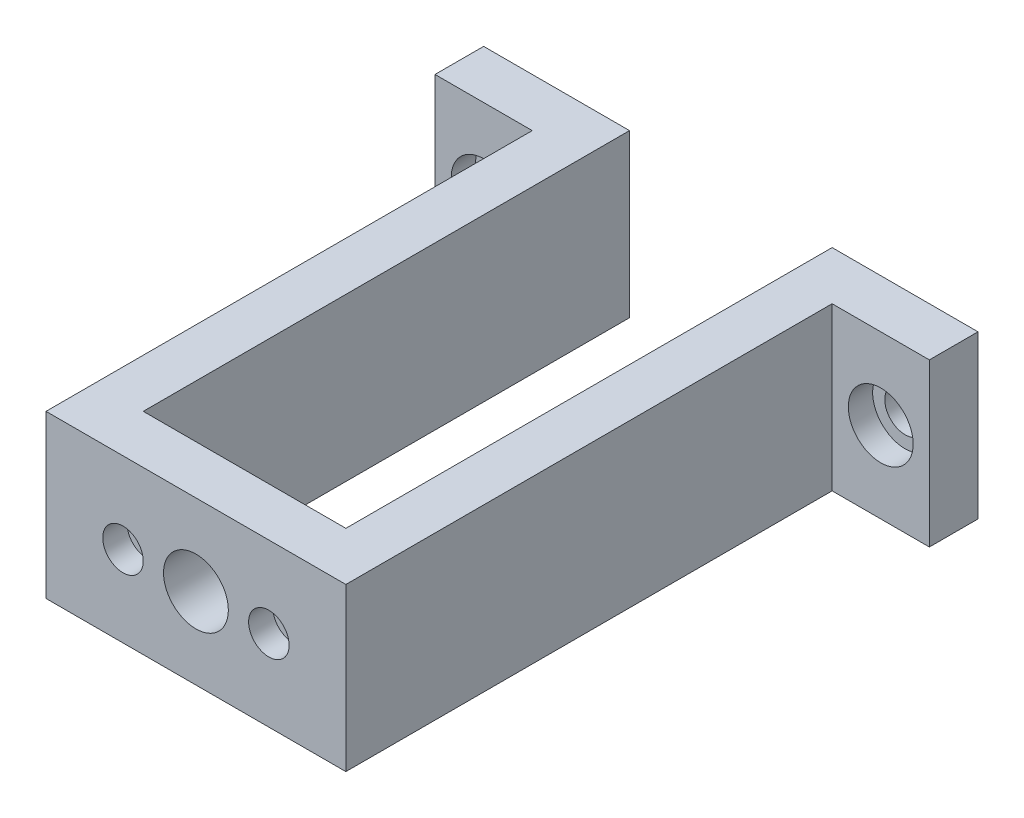
ISO-10303-21;
HEADER;
FILE_DESCRIPTION(('STEP AP214'),'2;1');
FILE_NAME('part.step','',(''),(''),'','','');
FILE_SCHEMA(('AUTOMOTIVE_DESIGN { 1 0 10303 214 1 1 1 1 }'));
ENDSEC;
DATA;
#1=APPLICATION_CONTEXT('core data for automotive mechanical design processes');
#2=APPLICATION_PROTOCOL_DEFINITION('international standard','automotive_design',2000,#1);
#3=PRODUCT_CONTEXT('',#1,'mechanical');
#4=PRODUCT('Part','Part','',(#3));
#5=PRODUCT_RELATED_PRODUCT_CATEGORY('part','',(#4));
#6=PRODUCT_DEFINITION_FORMATION('','',#4);
#7=PRODUCT_DEFINITION_CONTEXT('part definition',#1,'design');
#8=PRODUCT_DEFINITION('design','',#6,#7);
#9=PRODUCT_DEFINITION_SHAPE('','',#8);
#10=(LENGTH_UNIT() NAMED_UNIT(*) SI_UNIT(.MILLI.,.METRE.));
#11=(NAMED_UNIT(*) PLANE_ANGLE_UNIT() SI_UNIT($,.RADIAN.));
#12=(NAMED_UNIT(*) SI_UNIT($,.STERADIAN.) SOLID_ANGLE_UNIT());
#13=UNCERTAINTY_MEASURE_WITH_UNIT(LENGTH_MEASURE(1.E-05),#10,'distance_accuracy_value','');
#14=(GEOMETRIC_REPRESENTATION_CONTEXT(3) GLOBAL_UNCERTAINTY_ASSIGNED_CONTEXT((#13)) GLOBAL_UNIT_ASSIGNED_CONTEXT((#10,
#11,#12)) REPRESENTATION_CONTEXT('',''));
#15=CARTESIAN_POINT('',(0.,0.,0.));
#16=DIRECTION('',(0.,0.,1.));
#17=DIRECTION('',(1.,0.,0.));
#18=AXIS2_PLACEMENT_3D('',#15,#16,#17);
#19=CARTESIAN_POINT('',(-18.5,0.,-30.));
#20=DIRECTION('',(0.,0.,1.));
#21=DIRECTION('',(1.,0.,0.));
#22=AXIS2_PLACEMENT_3D('',#19,#20,#21);
#23=CYLINDRICAL_SURFACE('',#22,1.25);
#24=CARTESIAN_POINT('',(-18.5,0.,-30.));
#25=DIRECTION('',(0.,0.,-1.));
#26=DIRECTION('',(-1.,0.,0.));
#27=AXIS2_PLACEMENT_3D('',#24,#25,#26);
#28=CIRCLE('',#27,1.25);
#29=CARTESIAN_POINT('',(-19.75,0.,-30.));
#30=VERTEX_POINT('',#29);
#31=EDGE_CURVE('E382',#30,#30,#28,.T.);
#32=ORIENTED_EDGE('',*,*,#31,.T.);
#33=EDGE_LOOP('',(#32));
#34=FACE_BOUND('',#33,.T.);
#35=CARTESIAN_POINT('',(-18.5,0.,-28.5));
#36=DIRECTION('',(0.,0.,1.));
#37=DIRECTION('',(1.,0.,0.));
#38=AXIS2_PLACEMENT_3D('',#35,#36,#37);
#39=CIRCLE('',#38,1.25);
#40=CARTESIAN_POINT('',(-17.25,0.,-28.5));
#41=VERTEX_POINT('',#40);
#42=EDGE_CURVE('E406',#41,#41,#39,.T.);
#43=ORIENTED_EDGE('',*,*,#42,.T.);
#44=EDGE_LOOP('',(#43));
#45=FACE_BOUND('',#44,.T.);
#46=ADVANCED_FACE('F55',(#34,#45),#23,.F.);
#47=CARTESIAN_POINT('',(6.,0.,-30.));
#48=DIRECTION('',(0.,0.,1.));
#49=DIRECTION('',(1.,0.,0.));
#50=AXIS2_PLACEMENT_3D('',#47,#48,#49);
#51=CYLINDRICAL_SURFACE('',#50,1.25);
#52=CARTESIAN_POINT('',(6.,0.,-30.));
#53=DIRECTION('',(0.,0.,-1.));
#54=DIRECTION('',(-1.,0.,0.));
#55=AXIS2_PLACEMENT_3D('',#52,#53,#54);
#56=CIRCLE('',#55,1.25);
#57=CARTESIAN_POINT('',(4.75,0.,-30.));
#58=VERTEX_POINT('',#57);
#59=EDGE_CURVE('E393',#58,#58,#56,.T.);
#60=ORIENTED_EDGE('',*,*,#59,.T.);
#61=EDGE_LOOP('',(#60));
#62=FACE_BOUND('',#61,.T.);
#63=CARTESIAN_POINT('',(6.,0.,-28.5));
#64=DIRECTION('',(0.,0.,1.));
#65=DIRECTION('',(1.,0.,0.));
#66=AXIS2_PLACEMENT_3D('',#63,#64,#65);
#67=CIRCLE('',#66,1.25);
#68=CARTESIAN_POINT('',(7.25,0.,-28.5));
#69=VERTEX_POINT('',#68);
#70=EDGE_CURVE('E403',#69,#69,#67,.T.);
#71=ORIENTED_EDGE('',*,*,#70,.T.);
#72=EDGE_LOOP('',(#71));
#73=FACE_BOUND('',#72,.T.);
#74=ADVANCED_FACE('F282',(#62,#73),#51,.F.);
#75=CARTESIAN_POINT('',(-12.5,-5.,3.));
#76=DIRECTION('',(0.,1.,0.));
#77=DIRECTION('',(0.,0.,1.));
#78=AXIS2_PLACEMENT_3D('',#75,#76,#77);
#79=PLANE('',#78);
#80=DIRECTION('',(-1.,0.,0.));
#81=VECTOR('',#80,1.);
#82=CARTESIAN_POINT('',(0.,-5.,-27.));
#83=LINE('',#82,#81);
#84=CARTESIAN_POINT('',(9.,-5.,-27.));
#85=VERTEX_POINT('',#84);
#86=CARTESIAN_POINT('',(3.,-5.,-27.));
#87=VERTEX_POINT('',#86);
#88=EDGE_CURVE('E144',#85,#87,#83,.T.);
#89=ORIENTED_EDGE('',*,*,#88,.T.);
#90=DIRECTION('',(0.,0.,-1.));
#91=VECTOR('',#90,1.);
#92=CARTESIAN_POINT('',(3.,-5.,13.4403065089106));
#93=LINE('',#92,#91);
#94=CARTESIAN_POINT('',(3.,-5.,3.));
#95=VERTEX_POINT('',#94);
#96=EDGE_CURVE('E191',#95,#87,#93,.T.);
#97=ORIENTED_EDGE('',*,*,#96,.F.);
#98=DIRECTION('',(1.,0.,0.));
#99=VECTOR('',#98,1.);
#100=CARTESIAN_POINT('',(-12.5,-5.,3.));
#101=LINE('',#100,#99);
#102=CARTESIAN_POINT('',(-15.5,-5.,3.));
#103=VERTEX_POINT('',#102);
#104=EDGE_CURVE('E64',#103,#95,#101,.T.);
#105=ORIENTED_EDGE('',*,*,#104,.F.);
#106=DIRECTION('',(0.,0.,-1.));
#107=VECTOR('',#106,1.);
#108=CARTESIAN_POINT('',(-15.5,-5.,13.4403065089106));
#109=LINE('',#108,#107);
#110=CARTESIAN_POINT('',(-15.5,-5.,-27.));
#111=VERTEX_POINT('',#110);
#112=EDGE_CURVE('E226',#103,#111,#109,.T.);
#113=ORIENTED_EDGE('',*,*,#112,.T.);
#114=DIRECTION('',(1.,0.,0.));
#115=VECTOR('',#114,1.);
#116=CARTESIAN_POINT('',(0.,-5.,-27.));
#117=LINE('',#116,#115);
#118=CARTESIAN_POINT('',(-21.5,-5.,-27.));
#119=VERTEX_POINT('',#118);
#120=EDGE_CURVE('E375',#119,#111,#117,.T.);
#121=ORIENTED_EDGE('',*,*,#120,.F.);
#122=DIRECTION('',(0.,0.,1.));
#123=VECTOR('',#122,1.);
#124=CARTESIAN_POINT('',(-21.5,-5.,-30.));
#125=LINE('',#124,#123);
#126=CARTESIAN_POINT('',(-21.5,-5.,-30.));
#127=VERTEX_POINT('',#126);
#128=EDGE_CURVE('E215',#127,#119,#125,.T.);
#129=ORIENTED_EDGE('',*,*,#128,.F.);
#130=DIRECTION('',(-1.,0.,0.));
#131=VECTOR('',#130,1.);
#132=CARTESIAN_POINT('',(-12.5,-5.,-30.));
#133=LINE('',#132,#131);
#134=CARTESIAN_POINT('',(-12.5,-5.,-30.));
#135=VERTEX_POINT('',#134);
#136=EDGE_CURVE('E199',#135,#127,#133,.T.);
#137=ORIENTED_EDGE('',*,*,#136,.F.);
#138=DIRECTION('',(0.,0.,1.));
#139=VECTOR('',#138,1.);
#140=CARTESIAN_POINT('',(-12.5,-5.,-30.));
#141=LINE('',#140,#139);
#142=CARTESIAN_POINT('',(-12.5,-5.,0.));
#143=VERTEX_POINT('',#142);
#144=EDGE_CURVE('E218',#135,#143,#141,.T.);
#145=ORIENTED_EDGE('',*,*,#144,.T.);
#146=DIRECTION('',(1.,0.,0.));
#147=VECTOR('',#146,1.);
#148=CARTESIAN_POINT('',(-12.5,-5.,0.));
#149=LINE('',#148,#147);
#150=CARTESIAN_POINT('',(0.,-5.,0.));
#151=VERTEX_POINT('',#150);
#152=EDGE_CURVE('E244',#143,#151,#149,.T.);
#153=ORIENTED_EDGE('',*,*,#152,.T.);
#154=DIRECTION('',(0.,0.,1.));
#155=VECTOR('',#154,1.);
#156=CARTESIAN_POINT('',(0.,-5.,-30.));
#157=LINE('',#156,#155);
#158=CARTESIAN_POINT('',(0.,-5.,-30.));
#159=VERTEX_POINT('',#158);
#160=EDGE_CURVE('E171',#159,#151,#157,.T.);
#161=ORIENTED_EDGE('',*,*,#160,.F.);
#162=DIRECTION('',(1.,0.,0.));
#163=VECTOR('',#162,1.);
#164=CARTESIAN_POINT('',(0.,-5.,-30.));
#165=LINE('',#164,#163);
#166=CARTESIAN_POINT('',(9.,-5.,-30.));
#167=VERTEX_POINT('',#166);
#168=EDGE_CURVE('E170',#159,#167,#165,.T.);
#169=ORIENTED_EDGE('',*,*,#168,.T.);
#170=DIRECTION('',(0.,0.,1.));
#171=VECTOR('',#170,1.);
#172=CARTESIAN_POINT('',(9.,-5.,-30.));
#173=LINE('',#172,#171);
#174=EDGE_CURVE('E162',#167,#85,#173,.T.);
#175=ORIENTED_EDGE('',*,*,#174,.T.);
#176=EDGE_LOOP('',(#89,#97,#105,#113,#121,#129,#137,#145,#153,#161,#169,#175));
#177=FACE_BOUND('',#176,.T.);
#178=ADVANCED_FACE('F57',(#177),#79,.F.);
#179=CARTESIAN_POINT('',(-12.5,5.,3.));
#180=DIRECTION('',(0.,1.,0.));
#181=DIRECTION('',(0.,0.,1.));
#182=AXIS2_PLACEMENT_3D('',#179,#180,#181);
#183=PLANE('',#182);
#184=DIRECTION('',(0.,0.,-1.));
#185=VECTOR('',#184,1.);
#186=CARTESIAN_POINT('',(3.,5.,13.4403065089106));
#187=LINE('',#186,#185);
#188=CARTESIAN_POINT('',(3.,5.,3.));
#189=VERTEX_POINT('',#188);
#190=CARTESIAN_POINT('',(3.,5.,-27.));
#191=VERTEX_POINT('',#190);
#192=EDGE_CURVE('E193',#189,#191,#187,.T.);
#193=ORIENTED_EDGE('',*,*,#192,.T.);
#194=DIRECTION('',(-1.,0.,0.));
#195=VECTOR('',#194,1.);
#196=CARTESIAN_POINT('',(0.,5.,-27.));
#197=LINE('',#196,#195);
#198=CARTESIAN_POINT('',(9.,5.,-27.));
#199=VERTEX_POINT('',#198);
#200=EDGE_CURVE('E166',#199,#191,#197,.T.);
#201=ORIENTED_EDGE('',*,*,#200,.F.);
#202=DIRECTION('',(0.,0.,1.));
#203=VECTOR('',#202,1.);
#204=CARTESIAN_POINT('',(9.,5.,-30.));
#205=LINE('',#204,#203);
#206=CARTESIAN_POINT('',(9.,5.,-30.));
#207=VERTEX_POINT('',#206);
#208=EDGE_CURVE('E165',#207,#199,#205,.T.);
#209=ORIENTED_EDGE('',*,*,#208,.F.);
#210=DIRECTION('',(1.,0.,0.));
#211=VECTOR('',#210,1.);
#212=CARTESIAN_POINT('',(0.,5.,-30.));
#213=LINE('',#212,#211);
#214=CARTESIAN_POINT('',(0.,5.,-30.));
#215=VERTEX_POINT('',#214);
#216=EDGE_CURVE('E174',#215,#207,#213,.T.);
#217=ORIENTED_EDGE('',*,*,#216,.F.);
#218=DIRECTION('',(0.,0.,1.));
#219=VECTOR('',#218,1.);
#220=CARTESIAN_POINT('',(0.,5.,-30.));
#221=LINE('',#220,#219);
#222=CARTESIAN_POINT('',(0.,5.,0.));
#223=VERTEX_POINT('',#222);
#224=EDGE_CURVE('E155',#215,#223,#221,.T.);
#225=ORIENTED_EDGE('',*,*,#224,.T.);
#226=DIRECTION('',(1.,0.,0.));
#227=VECTOR('',#226,1.);
#228=CARTESIAN_POINT('',(-12.5,5.,0.));
#229=LINE('',#228,#227);
#230=CARTESIAN_POINT('',(-12.5,5.,0.));
#231=VERTEX_POINT('',#230);
#232=EDGE_CURVE('E77',#231,#223,#229,.T.);
#233=ORIENTED_EDGE('',*,*,#232,.F.);
#234=DIRECTION('',(0.,0.,1.));
#235=VECTOR('',#234,1.);
#236=CARTESIAN_POINT('',(-12.5,5.,-30.));
#237=LINE('',#236,#235);
#238=CARTESIAN_POINT('',(-12.5,5.,-30.));
#239=VERTEX_POINT('',#238);
#240=EDGE_CURVE('E207',#239,#231,#237,.T.);
#241=ORIENTED_EDGE('',*,*,#240,.F.);
#242=DIRECTION('',(-1.,0.,0.));
#243=VECTOR('',#242,1.);
#244=CARTESIAN_POINT('',(-12.5,5.,-30.));
#245=LINE('',#244,#243);
#246=CARTESIAN_POINT('',(-21.5,5.,-30.));
#247=VERTEX_POINT('',#246);
#248=EDGE_CURVE('E204',#239,#247,#245,.T.);
#249=ORIENTED_EDGE('',*,*,#248,.T.);
#250=DIRECTION('',(0.,0.,1.));
#251=VECTOR('',#250,1.);
#252=CARTESIAN_POINT('',(-21.5,5.,-30.));
#253=LINE('',#252,#251);
#254=CARTESIAN_POINT('',(-21.5,5.,-27.));
#255=VERTEX_POINT('',#254);
#256=EDGE_CURVE('E212',#247,#255,#253,.T.);
#257=ORIENTED_EDGE('',*,*,#256,.T.);
#258=DIRECTION('',(1.,0.,0.));
#259=VECTOR('',#258,1.);
#260=CARTESIAN_POINT('',(0.,5.,-27.));
#261=LINE('',#260,#259);
#262=CARTESIAN_POINT('',(-15.5,5.,-27.));
#263=VERTEX_POINT('',#262);
#264=EDGE_CURVE('E367',#255,#263,#261,.T.);
#265=ORIENTED_EDGE('',*,*,#264,.T.);
#266=DIRECTION('',(0.,0.,-1.));
#267=VECTOR('',#266,1.);
#268=CARTESIAN_POINT('',(-15.5,5.,13.4403065089106));
#269=LINE('',#268,#267);
#270=CARTESIAN_POINT('',(-15.5,5.,3.));
#271=VERTEX_POINT('',#270);
#272=EDGE_CURVE('E221',#271,#263,#269,.T.);
#273=ORIENTED_EDGE('',*,*,#272,.F.);
#274=DIRECTION('',(1.,0.,0.));
#275=VECTOR('',#274,1.);
#276=CARTESIAN_POINT('',(-12.5,5.,3.));
#277=LINE('',#276,#275);
#278=EDGE_CURVE('E13',#271,#189,#277,.T.);
#279=ORIENTED_EDGE('',*,*,#278,.T.);
#280=EDGE_LOOP('',(#193,#201,#209,#217,#225,#233,#241,#249,#257,#265,#273,#279));
#281=FACE_BOUND('',#280,.T.);
#282=ADVANCED_FACE('F325',(#281),#183,.T.);
#283=CARTESIAN_POINT('',(-21.5,5.,-30.));
#284=DIRECTION('',(-1.,0.,0.));
#285=DIRECTION('',(0.,0.,1.));
#286=AXIS2_PLACEMENT_3D('',#283,#284,#285);
#287=PLANE('',#286);
#288=ORIENTED_EDGE('',*,*,#128,.T.);
#289=DIRECTION('',(0.,1.,0.));
#290=VECTOR('',#289,1.);
#291=CARTESIAN_POINT('',(-21.5,0.,-27.));
#292=LINE('',#291,#290);
#293=EDGE_CURVE('E167',#119,#255,#292,.T.);
#294=ORIENTED_EDGE('',*,*,#293,.T.);
#295=ORIENTED_EDGE('',*,*,#256,.F.);
#296=DIRECTION('',(0.,-1.,0.));
#297=VECTOR('',#296,1.);
#298=CARTESIAN_POINT('',(-21.5,5.,-30.));
#299=LINE('',#298,#297);
#300=EDGE_CURVE('E201',#247,#127,#299,.T.);
#301=ORIENTED_EDGE('',*,*,#300,.T.);
#302=EDGE_LOOP('',(#288,#294,#295,#301));
#303=FACE_BOUND('',#302,.T.);
#304=ADVANCED_FACE('F311',(#303),#287,.T.);
#305=CARTESIAN_POINT('',(9.,5.,-30.));
#306=DIRECTION('',(-1.,0.,0.));
#307=DIRECTION('',(0.,0.,1.));
#308=AXIS2_PLACEMENT_3D('',#305,#306,#307);
#309=PLANE('',#308);
#310=DIRECTION('',(0.,1.,0.));
#311=VECTOR('',#310,1.);
#312=CARTESIAN_POINT('',(9.,0.,-27.));
#313=LINE('',#312,#311);
#314=EDGE_CURVE('E148',#85,#199,#313,.T.);
#315=ORIENTED_EDGE('',*,*,#314,.F.);
#316=ORIENTED_EDGE('',*,*,#174,.F.);
#317=DIRECTION('',(0.,-1.,0.));
#318=VECTOR('',#317,1.);
#319=CARTESIAN_POINT('',(9.,5.,-30.));
#320=LINE('',#319,#318);
#321=EDGE_CURVE('E184',#207,#167,#320,.T.);
#322=ORIENTED_EDGE('',*,*,#321,.F.);
#323=ORIENTED_EDGE('',*,*,#208,.T.);
#324=EDGE_LOOP('',(#315,#316,#322,#323));
#325=FACE_BOUND('',#324,.T.);
#326=ADVANCED_FACE('F160',(#325),#309,.F.);
#327=CARTESIAN_POINT('',(0.,0.,0.));
#328=DIRECTION('',(0.,0.,1.));
#329=DIRECTION('',(1.,0.,0.));
#330=AXIS2_PLACEMENT_3D('',#327,#328,#329);
#331=PLANE('',#330);
#332=CARTESIAN_POINT('',(-6.25,0.,0.));
#333=DIRECTION('',(0.,0.,1.));
#334=DIRECTION('',(1.,0.,0.));
#335=AXIS2_PLACEMENT_3D('',#332,#333,#334);
#336=CIRCLE('',#335,2.);
#337=CARTESIAN_POINT('',(-4.25,0.,0.));
#338=VERTEX_POINT('',#337);
#339=EDGE_CURVE('E251',#338,#338,#336,.T.);
#340=ORIENTED_EDGE('',*,*,#339,.T.);
#341=EDGE_LOOP('',(#340));
#342=FACE_BOUND('',#341,.T.);
#343=CARTESIAN_POINT('',(-10.75,0.,0.));
#344=DIRECTION('',(0.,0.,1.));
#345=DIRECTION('',(1.,0.,0.));
#346=AXIS2_PLACEMENT_3D('',#343,#344,#345);
#347=CIRCLE('',#346,0.85);
#348=CARTESIAN_POINT('',(-9.9,0.,0.));
#349=VERTEX_POINT('',#348);
#350=EDGE_CURVE('E245',#349,#349,#347,.T.);
#351=ORIENTED_EDGE('',*,*,#350,.T.);
#352=EDGE_LOOP('',(#351));
#353=FACE_BOUND('',#352,.T.);
#354=CARTESIAN_POINT('',(-1.75,0.,0.));
#355=DIRECTION('',(0.,0.,1.));
#356=DIRECTION('',(1.,0.,0.));
#357=AXIS2_PLACEMENT_3D('',#354,#355,#356);
#358=CIRCLE('',#357,0.849999999999999);
#359=CARTESIAN_POINT('',(-0.9,0.,0.));
#360=VERTEX_POINT('',#359);
#361=EDGE_CURVE('E241',#360,#360,#358,.T.);
#362=ORIENTED_EDGE('',*,*,#361,.T.);
#363=EDGE_LOOP('',(#362));
#364=FACE_BOUND('',#363,.T.);
#365=ORIENTED_EDGE('',*,*,#232,.T.);
#366=DIRECTION('',(0.,-1.,0.));
#367=VECTOR('',#366,1.);
#368=CARTESIAN_POINT('',(0.,5.,0.));
#369=LINE('',#368,#367);
#370=EDGE_CURVE('E72',#223,#151,#369,.T.);
#371=ORIENTED_EDGE('',*,*,#370,.T.);
#372=ORIENTED_EDGE('',*,*,#152,.F.);
#373=DIRECTION('',(0.,-1.,0.));
#374=VECTOR('',#373,1.);
#375=CARTESIAN_POINT('',(-12.5,5.,0.));
#376=LINE('',#375,#374);
#377=EDGE_CURVE('E195',#231,#143,#376,.T.);
#378=ORIENTED_EDGE('',*,*,#377,.F.);
#379=EDGE_LOOP('',(#365,#371,#372,#378));
#380=FACE_BOUND('',#379,.T.);
#381=ADVANCED_FACE('F267',(#342,#353,#364,#380),#331,.F.);
#382=CARTESIAN_POINT('',(-10.75,0.,0.));
#383=DIRECTION('',(0.,0.,1.));
#384=DIRECTION('',(1.,0.,0.));
#385=AXIS2_PLACEMENT_3D('',#382,#383,#384);
#386=CYLINDRICAL_SURFACE('',#385,0.85);
#387=ORIENTED_EDGE('',*,*,#350,.F.);
#388=EDGE_LOOP('',(#387));
#389=FACE_BOUND('',#388,.T.);
#390=CARTESIAN_POINT('',(-10.75,0.,1.5));
#391=DIRECTION('',(0.,0.,1.));
#392=DIRECTION('',(1.,0.,0.));
#393=AXIS2_PLACEMENT_3D('',#390,#391,#392);
#394=CIRCLE('',#393,0.85);
#395=CARTESIAN_POINT('',(-9.9,0.,1.5));
#396=VERTEX_POINT('',#395);
#397=EDGE_CURVE('E59',#396,#396,#394,.F.);
#398=ORIENTED_EDGE('',*,*,#397,.F.);
#399=EDGE_LOOP('',(#398));
#400=FACE_BOUND('',#399,.T.);
#401=ADVANCED_FACE('F264',(#389,#400),#386,.F.);
#402=CARTESIAN_POINT('',(-1.75,0.,0.));
#403=DIRECTION('',(0.,0.,1.));
#404=DIRECTION('',(1.,0.,0.));
#405=AXIS2_PLACEMENT_3D('',#402,#403,#404);
#406=CYLINDRICAL_SURFACE('',#405,0.849999999999999);
#407=ORIENTED_EDGE('',*,*,#361,.F.);
#408=EDGE_LOOP('',(#407));
#409=FACE_BOUND('',#408,.T.);
#410=CARTESIAN_POINT('',(-1.75,0.,1.5));
#411=DIRECTION('',(0.,0.,1.));
#412=DIRECTION('',(1.,0.,0.));
#413=AXIS2_PLACEMENT_3D('',#410,#411,#412);
#414=CIRCLE('',#413,0.849999999999999);
#415=CARTESIAN_POINT('',(-0.9,0.,1.5));
#416=VERTEX_POINT('',#415);
#417=EDGE_CURVE('E232',#416,#416,#414,.F.);
#418=ORIENTED_EDGE('',*,*,#417,.F.);
#419=EDGE_LOOP('',(#418));
#420=FACE_BOUND('',#419,.T.);
#421=ADVANCED_FACE('F266',(#409,#420),#406,.F.);
#422=CARTESIAN_POINT('',(0.,0.,3.));
#423=DIRECTION('',(0.,0.,1.));
#424=DIRECTION('',(1.,0.,0.));
#425=AXIS2_PLACEMENT_3D('',#422,#423,#424);
#426=PLANE('',#425);
#427=CARTESIAN_POINT('',(-1.75,0.,3.));
#428=DIRECTION('',(0.,0.,1.));
#429=DIRECTION('',(1.,0.,0.));
#430=AXIS2_PLACEMENT_3D('',#427,#428,#429);
#431=CIRCLE('',#430,1.25);
#432=CARTESIAN_POINT('',(-0.499999999999999,0.,3.));
#433=VERTEX_POINT('',#432);
#434=EDGE_CURVE('E233',#433,#433,#431,.T.);
#435=ORIENTED_EDGE('',*,*,#434,.F.);
#436=EDGE_LOOP('',(#435));
#437=FACE_BOUND('',#436,.T.);
#438=CARTESIAN_POINT('',(-10.75,0.,3.));
#439=DIRECTION('',(0.,0.,1.));
#440=DIRECTION('',(1.,0.,0.));
#441=AXIS2_PLACEMENT_3D('',#438,#439,#440);
#442=CIRCLE('',#441,1.25);
#443=CARTESIAN_POINT('',(-9.5,0.,3.));
#444=VERTEX_POINT('',#443);
#445=EDGE_CURVE('E236',#444,#444,#442,.T.);
#446=ORIENTED_EDGE('',*,*,#445,.F.);
#447=EDGE_LOOP('',(#446));
#448=FACE_BOUND('',#447,.T.);
#449=CARTESIAN_POINT('',(-6.25,0.,3.));
#450=DIRECTION('',(0.,0.,1.));
#451=DIRECTION('',(1.,0.,0.));
#452=AXIS2_PLACEMENT_3D('',#449,#450,#451);
#453=CIRCLE('',#452,2.);
#454=CARTESIAN_POINT('',(-4.25,0.,3.));
#455=VERTEX_POINT('',#454);
#456=EDGE_CURVE('E248',#455,#455,#453,.T.);
#457=ORIENTED_EDGE('',*,*,#456,.F.);
#458=EDGE_LOOP('',(#457));
#459=FACE_BOUND('',#458,.T.);
#460=ORIENTED_EDGE('',*,*,#278,.F.);
#461=DIRECTION('',(0.,-1.,0.));
#462=VECTOR('',#461,1.);
#463=CARTESIAN_POINT('',(-15.5,0.,3.));
#464=LINE('',#463,#462);
#465=EDGE_CURVE('E222',#271,#103,#464,.T.);
#466=ORIENTED_EDGE('',*,*,#465,.T.);
#467=ORIENTED_EDGE('',*,*,#104,.T.);
#468=DIRECTION('',(0.,-1.,0.));
#469=VECTOR('',#468,1.);
#470=CARTESIAN_POINT('',(3.,0.,3.));
#471=LINE('',#470,#469);
#472=EDGE_CURVE('E181',#189,#95,#471,.T.);
#473=ORIENTED_EDGE('',*,*,#472,.F.);
#474=EDGE_LOOP('',(#460,#466,#467,#473));
#475=FACE_BOUND('',#474,.T.);
#476=ADVANCED_FACE('F274',(#437,#448,#459,#475),#426,.T.);
#477=CARTESIAN_POINT('',(-6.25,0.,0.));
#478=DIRECTION('',(0.,0.,1.));
#479=DIRECTION('',(1.,0.,0.));
#480=AXIS2_PLACEMENT_3D('',#477,#478,#479);
#481=CYLINDRICAL_SURFACE('',#480,2.);
#482=ORIENTED_EDGE('',*,*,#456,.T.);
#483=EDGE_LOOP('',(#482));
#484=FACE_BOUND('',#483,.T.);
#485=ORIENTED_EDGE('',*,*,#339,.F.);
#486=EDGE_LOOP('',(#485));
#487=FACE_BOUND('',#486,.T.);
#488=ADVANCED_FACE('F339',(#484,#487),#481,.F.);
#489=CARTESIAN_POINT('',(-1.75,0.,1.5));
#490=DIRECTION('',(0.,0.,1.));
#491=DIRECTION('',(1.,0.,0.));
#492=AXIS2_PLACEMENT_3D('',#489,#490,#491);
#493=PLANE('',#492);
#494=CARTESIAN_POINT('',(-1.75,0.,1.5));
#495=DIRECTION('',(0.,0.,1.));
#496=DIRECTION('',(1.,0.,0.));
#497=AXIS2_PLACEMENT_3D('',#494,#495,#496);
#498=CIRCLE('',#497,1.25);
#499=CARTESIAN_POINT('',(-0.499999999999999,0.,1.5));
#500=VERTEX_POINT('',#499);
#501=EDGE_CURVE('E229',#500,#500,#498,.T.);
#502=ORIENTED_EDGE('',*,*,#501,.T.);
#503=EDGE_LOOP('',(#502));
#504=FACE_BOUND('',#503,.T.);
#505=ORIENTED_EDGE('',*,*,#417,.T.);
#506=EDGE_LOOP('',(#505));
#507=FACE_BOUND('',#506,.T.);
#508=ADVANCED_FACE('F335',(#504,#507),#493,.T.);
#509=CARTESIAN_POINT('',(-1.75,0.,1.5));
#510=DIRECTION('',(0.,0.,1.));
#511=DIRECTION('',(1.,0.,0.));
#512=AXIS2_PLACEMENT_3D('',#509,#510,#511);
#513=CYLINDRICAL_SURFACE('',#512,1.25);
#514=ORIENTED_EDGE('',*,*,#501,.F.);
#515=EDGE_LOOP('',(#514));
#516=FACE_BOUND('',#515,.T.);
#517=ORIENTED_EDGE('',*,*,#434,.T.);
#518=EDGE_LOOP('',(#517));
#519=FACE_BOUND('',#518,.T.);
#520=ADVANCED_FACE('F338',(#516,#519),#513,.F.);
#521=CARTESIAN_POINT('',(-10.75,0.,1.5));
#522=DIRECTION('',(0.,0.,1.));
#523=DIRECTION('',(1.,0.,0.));
#524=AXIS2_PLACEMENT_3D('',#521,#522,#523);
#525=PLANE('',#524);
#526=CARTESIAN_POINT('',(-10.75,0.,1.5));
#527=DIRECTION('',(0.,0.,1.));
#528=DIRECTION('',(1.,0.,0.));
#529=AXIS2_PLACEMENT_3D('',#526,#527,#528);
#530=CIRCLE('',#529,1.25);
#531=CARTESIAN_POINT('',(-9.5,0.,1.5));
#532=VERTEX_POINT('',#531);
#533=EDGE_CURVE('E225',#532,#532,#530,.T.);
#534=ORIENTED_EDGE('',*,*,#533,.T.);
#535=EDGE_LOOP('',(#534));
#536=FACE_BOUND('',#535,.T.);
#537=ORIENTED_EDGE('',*,*,#397,.T.);
#538=EDGE_LOOP('',(#537));
#539=FACE_BOUND('',#538,.T.);
#540=ADVANCED_FACE('F262',(#536,#539),#525,.T.);
#541=CARTESIAN_POINT('',(-10.75,0.,1.5));
#542=DIRECTION('',(0.,0.,1.));
#543=DIRECTION('',(1.,0.,0.));
#544=AXIS2_PLACEMENT_3D('',#541,#542,#543);
#545=CYLINDRICAL_SURFACE('',#544,1.25);
#546=ORIENTED_EDGE('',*,*,#533,.F.);
#547=EDGE_LOOP('',(#546));
#548=FACE_BOUND('',#547,.T.);
#549=ORIENTED_EDGE('',*,*,#445,.T.);
#550=EDGE_LOOP('',(#549));
#551=FACE_BOUND('',#550,.T.);
#552=ADVANCED_FACE('F333',(#548,#551),#545,.F.);
#553=CARTESIAN_POINT('',(-15.5,0.,13.4403065089106));
#554=DIRECTION('',(1.,0.,0.));
#555=DIRECTION('',(0.,0.,-1.));
#556=AXIS2_PLACEMENT_3D('',#553,#554,#555);
#557=PLANE('',#556);
#558=ORIENTED_EDGE('',*,*,#465,.F.);
#559=ORIENTED_EDGE('',*,*,#272,.T.);
#560=DIRECTION('',(0.,1.,0.));
#561=VECTOR('',#560,1.);
#562=CARTESIAN_POINT('',(-15.5,0.,-27.));
#563=LINE('',#562,#561);
#564=EDGE_CURVE('E371',#111,#263,#563,.T.);
#565=ORIENTED_EDGE('',*,*,#564,.F.);
#566=ORIENTED_EDGE('',*,*,#112,.F.);
#567=EDGE_LOOP('',(#558,#559,#565,#566));
#568=FACE_BOUND('',#567,.T.);
#569=ADVANCED_FACE('F329',(#568),#557,.F.);
#570=CARTESIAN_POINT('',(-12.5,5.,-30.));
#571=DIRECTION('',(-1.,0.,0.));
#572=DIRECTION('',(0.,0.,1.));
#573=AXIS2_PLACEMENT_3D('',#570,#571,#572);
#574=PLANE('',#573);
#575=ORIENTED_EDGE('',*,*,#377,.T.);
#576=ORIENTED_EDGE('',*,*,#144,.F.);
#577=DIRECTION('',(0.,-1.,0.));
#578=VECTOR('',#577,1.);
#579=CARTESIAN_POINT('',(-12.5,5.,-30.));
#580=LINE('',#579,#578);
#581=EDGE_CURVE('E196',#239,#135,#580,.T.);
#582=ORIENTED_EDGE('',*,*,#581,.F.);
#583=ORIENTED_EDGE('',*,*,#240,.T.);
#584=EDGE_LOOP('',(#575,#576,#582,#583));
#585=FACE_BOUND('',#584,.T.);
#586=ADVANCED_FACE('F321',(#585),#574,.F.);
#587=CARTESIAN_POINT('',(0.,0.,-30.));
#588=DIRECTION('',(0.,0.,-1.));
#589=DIRECTION('',(-1.,0.,0.));
#590=AXIS2_PLACEMENT_3D('',#587,#588,#589);
#591=PLANE('',#590);
#592=ORIENTED_EDGE('',*,*,#31,.F.);
#593=EDGE_LOOP('',(#592));
#594=FACE_BOUND('',#593,.T.);
#595=ORIENTED_EDGE('',*,*,#581,.T.);
#596=ORIENTED_EDGE('',*,*,#136,.T.);
#597=ORIENTED_EDGE('',*,*,#300,.F.);
#598=ORIENTED_EDGE('',*,*,#248,.F.);
#599=EDGE_LOOP('',(#595,#596,#597,#598));
#600=FACE_BOUND('',#599,.T.);
#601=ADVANCED_FACE('F317',(#594,#600),#591,.T.);
#602=CARTESIAN_POINT('',(3.,0.,13.4403065089106));
#603=DIRECTION('',(1.,0.,0.));
#604=DIRECTION('',(0.,1.,0.));
#605=AXIS2_PLACEMENT_3D('',#602,#603,#604);
#606=PLANE('',#605);
#607=ORIENTED_EDGE('',*,*,#192,.F.);
#608=ORIENTED_EDGE('',*,*,#472,.T.);
#609=ORIENTED_EDGE('',*,*,#96,.T.);
#610=DIRECTION('',(0.,1.,0.));
#611=VECTOR('',#610,1.);
#612=CARTESIAN_POINT('',(3.,0.,-27.));
#613=LINE('',#612,#611);
#614=EDGE_CURVE('E151',#87,#191,#613,.T.);
#615=ORIENTED_EDGE('',*,*,#614,.T.);
#616=EDGE_LOOP('',(#607,#608,#609,#615));
#617=FACE_BOUND('',#616,.T.);
#618=ADVANCED_FACE('F307',(#617),#606,.T.);
#619=CARTESIAN_POINT('',(0.,5.,-30.));
#620=DIRECTION('',(-1.,0.,0.));
#621=DIRECTION('',(0.,-1.,0.));
#622=AXIS2_PLACEMENT_3D('',#619,#620,#621);
#623=PLANE('',#622);
#624=ORIENTED_EDGE('',*,*,#370,.F.);
#625=ORIENTED_EDGE('',*,*,#224,.F.);
#626=DIRECTION('',(0.,-1.,0.));
#627=VECTOR('',#626,1.);
#628=CARTESIAN_POINT('',(0.,5.,-30.));
#629=LINE('',#628,#627);
#630=EDGE_CURVE('E182',#215,#159,#629,.T.);
#631=ORIENTED_EDGE('',*,*,#630,.T.);
#632=ORIENTED_EDGE('',*,*,#160,.T.);
#633=EDGE_LOOP('',(#624,#625,#631,#632));
#634=FACE_BOUND('',#633,.T.);
#635=ADVANCED_FACE('F304',(#634),#623,.T.);
#636=CARTESIAN_POINT('',(0.,0.,-30.));
#637=DIRECTION('',(0.,0.,1.));
#638=DIRECTION('',(1.,0.,0.));
#639=AXIS2_PLACEMENT_3D('',#636,#637,#638);
#640=PLANE('',#639);
#641=ORIENTED_EDGE('',*,*,#59,.F.);
#642=EDGE_LOOP('',(#641));
#643=FACE_BOUND('',#642,.T.);
#644=ORIENTED_EDGE('',*,*,#630,.F.);
#645=ORIENTED_EDGE('',*,*,#216,.T.);
#646=ORIENTED_EDGE('',*,*,#321,.T.);
#647=ORIENTED_EDGE('',*,*,#168,.F.);
#648=EDGE_LOOP('',(#644,#645,#646,#647));
#649=FACE_BOUND('',#648,.T.);
#650=ADVANCED_FACE('F299',(#643,#649),#640,.F.);
#651=CARTESIAN_POINT('',(0.,0.,-27.));
#652=DIRECTION('',(0.,0.,1.));
#653=DIRECTION('',(1.,0.,0.));
#654=AXIS2_PLACEMENT_3D('',#651,#652,#653);
#655=PLANE('',#654);
#656=CARTESIAN_POINT('',(6.,0.,-27.));
#657=DIRECTION('',(0.,0.,1.));
#658=DIRECTION('',(1.,0.,0.));
#659=AXIS2_PLACEMENT_3D('',#656,#657,#658);
#660=CIRCLE('',#659,2.);
#661=CARTESIAN_POINT('',(8.,0.,-27.));
#662=VERTEX_POINT('',#661);
#663=EDGE_CURVE('E399',#662,#662,#660,.T.);
#664=ORIENTED_EDGE('',*,*,#663,.F.);
#665=EDGE_LOOP('',(#664));
#666=FACE_BOUND('',#665,.T.);
#667=ORIENTED_EDGE('',*,*,#614,.F.);
#668=ORIENTED_EDGE('',*,*,#88,.F.);
#669=ORIENTED_EDGE('',*,*,#314,.T.);
#670=ORIENTED_EDGE('',*,*,#200,.T.);
#671=EDGE_LOOP('',(#667,#668,#669,#670));
#672=FACE_BOUND('',#671,.T.);
#673=ADVANCED_FACE('F146',(#666,#672),#655,.T.);
#674=CARTESIAN_POINT('',(0.,0.,-27.));
#675=DIRECTION('',(0.,0.,1.));
#676=DIRECTION('',(1.,0.,0.));
#677=AXIS2_PLACEMENT_3D('',#674,#675,#676);
#678=PLANE('',#677);
#679=CARTESIAN_POINT('',(-18.5,0.,-27.));
#680=DIRECTION('',(0.,0.,1.));
#681=DIRECTION('',(1.,0.,0.));
#682=AXIS2_PLACEMENT_3D('',#679,#680,#681);
#683=CIRCLE('',#682,2.);
#684=CARTESIAN_POINT('',(-16.5,0.,-27.));
#685=VERTEX_POINT('',#684);
#686=EDGE_CURVE('E409',#685,#685,#683,.T.);
#687=ORIENTED_EDGE('',*,*,#686,.F.);
#688=EDGE_LOOP('',(#687));
#689=FACE_BOUND('',#688,.T.);
#690=ORIENTED_EDGE('',*,*,#264,.F.);
#691=ORIENTED_EDGE('',*,*,#293,.F.);
#692=ORIENTED_EDGE('',*,*,#120,.T.);
#693=ORIENTED_EDGE('',*,*,#564,.T.);
#694=EDGE_LOOP('',(#690,#691,#692,#693));
#695=FACE_BOUND('',#694,.T.);
#696=ADVANCED_FACE('F298',(#689,#695),#678,.T.);
#697=CARTESIAN_POINT('',(6.,0.,-28.5));
#698=DIRECTION('',(0.,0.,1.));
#699=DIRECTION('',(1.,0.,0.));
#700=AXIS2_PLACEMENT_3D('',#697,#698,#699);
#701=CYLINDRICAL_SURFACE('',#700,2.);
#702=CARTESIAN_POINT('',(6.,0.,-28.5));
#703=DIRECTION('',(0.,0.,1.));
#704=DIRECTION('',(1.,0.,0.));
#705=AXIS2_PLACEMENT_3D('',#702,#703,#704);
#706=CIRCLE('',#705,2.);
#707=CARTESIAN_POINT('',(8.,0.,-28.5));
#708=VERTEX_POINT('',#707);
#709=EDGE_CURVE('E402',#708,#708,#706,.T.);
#710=ORIENTED_EDGE('',*,*,#709,.F.);
#711=EDGE_LOOP('',(#710));
#712=FACE_BOUND('',#711,.T.);
#713=ORIENTED_EDGE('',*,*,#663,.T.);
#714=EDGE_LOOP('',(#713));
#715=FACE_BOUND('',#714,.T.);
#716=ADVANCED_FACE('F293',(#712,#715),#701,.F.);
#717=CARTESIAN_POINT('',(6.,0.,-28.5));
#718=DIRECTION('',(0.,0.,1.));
#719=DIRECTION('',(1.,0.,0.));
#720=AXIS2_PLACEMENT_3D('',#717,#718,#719);
#721=PLANE('',#720);
#722=ORIENTED_EDGE('',*,*,#70,.F.);
#723=EDGE_LOOP('',(#722));
#724=FACE_BOUND('',#723,.T.);
#725=ORIENTED_EDGE('',*,*,#709,.T.);
#726=EDGE_LOOP('',(#725));
#727=FACE_BOUND('',#726,.T.);
#728=ADVANCED_FACE('F426',(#724,#727),#721,.T.);
#729=CARTESIAN_POINT('',(-18.5,0.,-28.5));
#730=DIRECTION('',(0.,0.,1.));
#731=DIRECTION('',(1.,0.,0.));
#732=AXIS2_PLACEMENT_3D('',#729,#730,#731);
#733=CYLINDRICAL_SURFACE('',#732,2.);
#734=CARTESIAN_POINT('',(-18.5,0.,-28.5));
#735=DIRECTION('',(0.,0.,1.));
#736=DIRECTION('',(1.,0.,0.));
#737=AXIS2_PLACEMENT_3D('',#734,#735,#736);
#738=CIRCLE('',#737,2.);
#739=CARTESIAN_POINT('',(-16.5,0.,-28.5));
#740=VERTEX_POINT('',#739);
#741=EDGE_CURVE('E397',#740,#740,#738,.T.);
#742=ORIENTED_EDGE('',*,*,#741,.F.);
#743=EDGE_LOOP('',(#742));
#744=FACE_BOUND('',#743,.T.);
#745=ORIENTED_EDGE('',*,*,#686,.T.);
#746=EDGE_LOOP('',(#745));
#747=FACE_BOUND('',#746,.T.);
#748=ADVANCED_FACE('F420',(#744,#747),#733,.F.);
#749=CARTESIAN_POINT('',(-18.5,0.,-28.5));
#750=DIRECTION('',(0.,0.,1.));
#751=DIRECTION('',(1.,0.,0.));
#752=AXIS2_PLACEMENT_3D('',#749,#750,#751);
#753=PLANE('',#752);
#754=ORIENTED_EDGE('',*,*,#42,.F.);
#755=EDGE_LOOP('',(#754));
#756=FACE_BOUND('',#755,.T.);
#757=ORIENTED_EDGE('',*,*,#741,.T.);
#758=EDGE_LOOP('',(#757));
#759=FACE_BOUND('',#758,.T.);
#760=ADVANCED_FACE('F417',(#756,#759),#753,.T.);
#761=CLOSED_SHELL('',(#46,#74,#178,#282,#304,#326,#381,#401,#421,#476,#488,#508,#520,#540,#552,
#569,#586,#601,#618,#635,#650,#673,#696,#716,#728,#748,#760));
#762=MANIFOLD_SOLID_BREP('B2',#761);
#763=ADVANCED_BREP_SHAPE_REPRESENTATION('',(#18,#762),#14);
#764=SHAPE_DEFINITION_REPRESENTATION(#9,#763);
ENDSEC;
END-ISO-10303-21;
